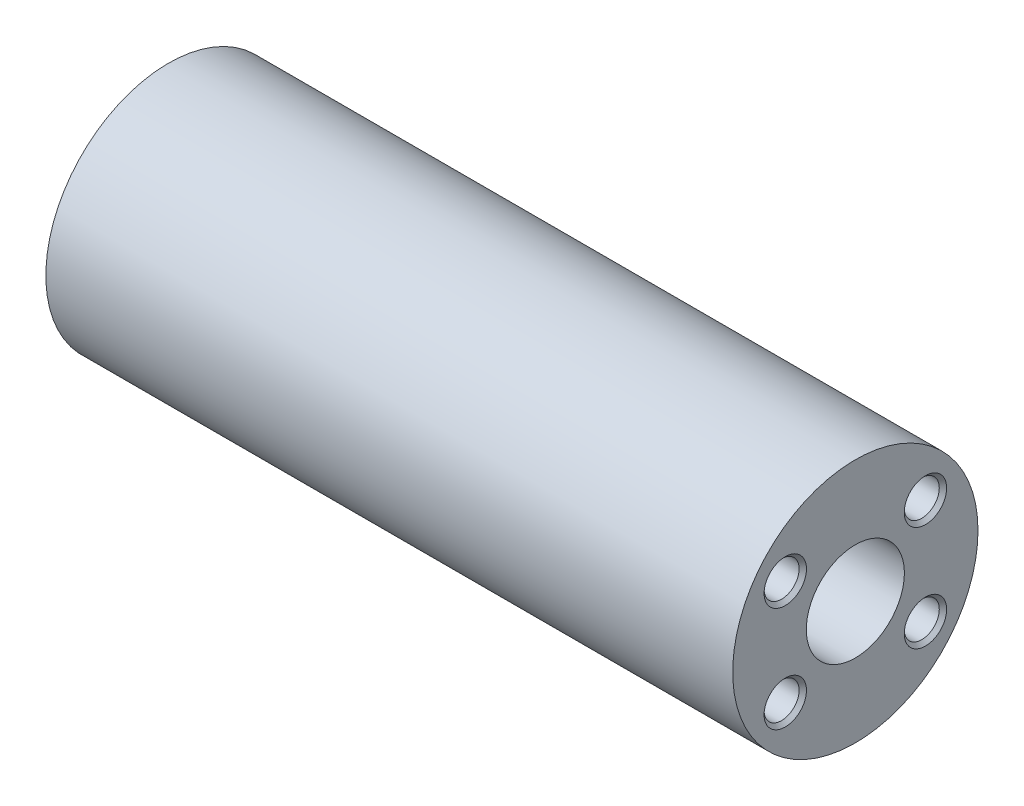
ISO-10303-21;
HEADER;
FILE_DESCRIPTION(('STEP AP214'),'2;1');
FILE_NAME('part.step','',(''),(''),'','','');
FILE_SCHEMA(('AUTOMOTIVE_DESIGN { 1 0 10303 214 1 1 1 1 }'));
ENDSEC;
DATA;
#1=APPLICATION_CONTEXT('core data for automotive mechanical design processes');
#2=APPLICATION_PROTOCOL_DEFINITION('international standard','automotive_design',2000,#1);
#3=PRODUCT_CONTEXT('',#1,'mechanical');
#4=PRODUCT('Part','Part','',(#3));
#5=PRODUCT_RELATED_PRODUCT_CATEGORY('part','',(#4));
#6=PRODUCT_DEFINITION_FORMATION('','',#4);
#7=PRODUCT_DEFINITION_CONTEXT('part definition',#1,'design');
#8=PRODUCT_DEFINITION('design','',#6,#7);
#9=PRODUCT_DEFINITION_SHAPE('','',#8);
#10=(LENGTH_UNIT() NAMED_UNIT(*) SI_UNIT(.MILLI.,.METRE.));
#11=(NAMED_UNIT(*) PLANE_ANGLE_UNIT() SI_UNIT($,.RADIAN.));
#12=(NAMED_UNIT(*) SI_UNIT($,.STERADIAN.) SOLID_ANGLE_UNIT());
#13=UNCERTAINTY_MEASURE_WITH_UNIT(LENGTH_MEASURE(1.E-05),#10,'distance_accuracy_value','');
#14=(GEOMETRIC_REPRESENTATION_CONTEXT(3) GLOBAL_UNCERTAINTY_ASSIGNED_CONTEXT((#13)) GLOBAL_UNIT_ASSIGNED_CONTEXT((#10,
#11,#12)) REPRESENTATION_CONTEXT('',''));
#15=CARTESIAN_POINT('',(0.,0.,0.));
#16=DIRECTION('',(0.,0.,1.));
#17=DIRECTION('',(1.,0.,0.));
#18=AXIS2_PLACEMENT_3D('',#15,#16,#17);
#19=CARTESIAN_POINT('',(49.,0.,0.));
#20=DIRECTION('',(-1.,0.,0.));
#21=DIRECTION('',(0.,0.,1.));
#22=AXIS2_PLACEMENT_3D('',#19,#20,#21);
#23=CYLINDRICAL_SURFACE('',#22,17.5);
#24=CARTESIAN_POINT('',(49.,0.,0.));
#25=DIRECTION('',(1.,0.,0.));
#26=DIRECTION('',(0.,0.,-1.));
#27=AXIS2_PLACEMENT_3D('',#24,#25,#26);
#28=CIRCLE('',#27,17.5);
#29=CARTESIAN_POINT('',(49.,0.,-17.5));
#30=VERTEX_POINT('',#29);
#31=EDGE_CURVE('E11',#30,#30,#28,.T.);
#32=ORIENTED_EDGE('',*,*,#31,.F.);
#33=EDGE_LOOP('',(#32));
#34=FACE_BOUND('',#33,.T.);
#35=CARTESIAN_POINT('',(-49.,0.,0.));
#36=DIRECTION('',(1.,0.,0.));
#37=DIRECTION('',(0.,0.,-1.));
#38=AXIS2_PLACEMENT_3D('',#35,#36,#37);
#39=CIRCLE('',#38,17.5);
#40=CARTESIAN_POINT('',(-49.,0.,-17.5));
#41=VERTEX_POINT('',#40);
#42=EDGE_CURVE('E56',#41,#41,#39,.T.);
#43=ORIENTED_EDGE('',*,*,#42,.T.);
#44=EDGE_LOOP('',(#43));
#45=FACE_BOUND('',#44,.T.);
#46=ADVANCED_FACE('F53',(#34,#45),#23,.T.);
#47=CARTESIAN_POINT('',(49.,0.,0.));
#48=DIRECTION('',(1.,0.,0.));
#49=DIRECTION('',(0.,0.,-1.));
#50=AXIS2_PLACEMENT_3D('',#47,#48,#49);
#51=PLANE('',#50);
#52=CARTESIAN_POINT('',(49.,7.5,-10.));
#53=DIRECTION('',(1.,0.,0.));
#54=DIRECTION('',(0.,0.,-1.));
#55=AXIS2_PLACEMENT_3D('',#52,#53,#54);
#56=CIRCLE('',#55,3.025);
#57=CARTESIAN_POINT('',(49.,7.5,-13.025));
#58=VERTEX_POINT('',#57);
#59=EDGE_CURVE('E129',#58,#58,#56,.T.);
#60=ORIENTED_EDGE('',*,*,#59,.F.);
#61=EDGE_LOOP('',(#60));
#62=FACE_BOUND('',#61,.T.);
#63=CARTESIAN_POINT('',(49.,-7.5,10.));
#64=DIRECTION('',(1.,0.,0.));
#65=DIRECTION('',(0.,0.,-1.));
#66=AXIS2_PLACEMENT_3D('',#63,#64,#65);
#67=CIRCLE('',#66,3.025);
#68=CARTESIAN_POINT('',(49.,-7.5,6.975));
#69=VERTEX_POINT('',#68);
#70=EDGE_CURVE('E138',#69,#69,#67,.T.);
#71=ORIENTED_EDGE('',*,*,#70,.F.);
#72=EDGE_LOOP('',(#71));
#73=FACE_BOUND('',#72,.T.);
#74=CARTESIAN_POINT('',(49.,7.5,10.));
#75=DIRECTION('',(1.,0.,0.));
#76=DIRECTION('',(0.,0.,-1.));
#77=AXIS2_PLACEMENT_3D('',#74,#75,#76);
#78=CIRCLE('',#77,3.025);
#79=CARTESIAN_POINT('',(49.,7.5,6.975));
#80=VERTEX_POINT('',#79);
#81=EDGE_CURVE('E147',#80,#80,#78,.T.);
#82=ORIENTED_EDGE('',*,*,#81,.F.);
#83=EDGE_LOOP('',(#82));
#84=FACE_BOUND('',#83,.T.);
#85=CARTESIAN_POINT('',(49.,-7.5,-10.));
#86=DIRECTION('',(1.,0.,0.));
#87=DIRECTION('',(0.,0.,-1.));
#88=AXIS2_PLACEMENT_3D('',#85,#86,#87);
#89=CIRCLE('',#88,3.025);
#90=CARTESIAN_POINT('',(49.,-7.5,-13.025));
#91=VERTEX_POINT('',#90);
#92=EDGE_CURVE('E156',#91,#91,#89,.T.);
#93=ORIENTED_EDGE('',*,*,#92,.F.);
#94=EDGE_LOOP('',(#93));
#95=FACE_BOUND('',#94,.T.);
#96=CARTESIAN_POINT('',(49.,0.,0.));
#97=DIRECTION('',(1.,0.,0.));
#98=DIRECTION('',(0.,0.,-1.));
#99=AXIS2_PLACEMENT_3D('',#96,#97,#98);
#100=CIRCLE('',#99,7.);
#101=CARTESIAN_POINT('',(49.,0.,-7.));
#102=VERTEX_POINT('',#101);
#103=EDGE_CURVE('E165',#102,#102,#100,.T.);
#104=ORIENTED_EDGE('',*,*,#103,.F.);
#105=EDGE_LOOP('',(#104));
#106=FACE_BOUND('',#105,.T.);
#107=ORIENTED_EDGE('',*,*,#31,.T.);
#108=EDGE_LOOP('',(#107));
#109=FACE_BOUND('',#108,.T.);
#110=ADVANCED_FACE('F179',(#62,#73,#84,#95,#106,#109),#51,.T.);
#111=CARTESIAN_POINT('',(-49.,0.,0.));
#112=DIRECTION('',(1.,0.,0.));
#113=DIRECTION('',(0.,0.,-1.));
#114=AXIS2_PLACEMENT_3D('',#111,#112,#113);
#115=PLANE('',#114);
#116=CARTESIAN_POINT('',(-49.,7.5,-10.));
#117=DIRECTION('',(-1.,0.,0.));
#118=DIRECTION('',(0.,0.,1.));
#119=AXIS2_PLACEMENT_3D('',#116,#117,#118);
#120=CIRCLE('',#119,3.025);
#121=CARTESIAN_POINT('',(-49.,7.5,-6.975));
#122=VERTEX_POINT('',#121);
#123=EDGE_CURVE('E102',#122,#122,#120,.T.);
#124=ORIENTED_EDGE('',*,*,#123,.F.);
#125=EDGE_LOOP('',(#124));
#126=FACE_BOUND('',#125,.T.);
#127=CARTESIAN_POINT('',(-49.,-7.5,10.));
#128=DIRECTION('',(-1.,0.,0.));
#129=DIRECTION('',(0.,0.,1.));
#130=AXIS2_PLACEMENT_3D('',#127,#128,#129);
#131=CIRCLE('',#130,3.025);
#132=CARTESIAN_POINT('',(-49.,-7.5,13.025));
#133=VERTEX_POINT('',#132);
#134=EDGE_CURVE('E95',#133,#133,#131,.T.);
#135=ORIENTED_EDGE('',*,*,#134,.F.);
#136=EDGE_LOOP('',(#135));
#137=FACE_BOUND('',#136,.T.);
#138=CARTESIAN_POINT('',(-49.,7.5,10.));
#139=DIRECTION('',(-1.,0.,0.));
#140=DIRECTION('',(0.,0.,1.));
#141=AXIS2_PLACEMENT_3D('',#138,#139,#140);
#142=CIRCLE('',#141,3.025);
#143=CARTESIAN_POINT('',(-49.,7.5,13.025));
#144=VERTEX_POINT('',#143);
#145=EDGE_CURVE('E111',#144,#144,#142,.T.);
#146=ORIENTED_EDGE('',*,*,#145,.F.);
#147=EDGE_LOOP('',(#146));
#148=FACE_BOUND('',#147,.T.);
#149=CARTESIAN_POINT('',(-49.,-7.5,-10.));
#150=DIRECTION('',(-1.,0.,0.));
#151=DIRECTION('',(0.,0.,1.));
#152=AXIS2_PLACEMENT_3D('',#149,#150,#151);
#153=CIRCLE('',#152,3.025);
#154=CARTESIAN_POINT('',(-49.,-7.5,-6.975));
#155=VERTEX_POINT('',#154);
#156=EDGE_CURVE('E120',#155,#155,#153,.T.);
#157=ORIENTED_EDGE('',*,*,#156,.F.);
#158=EDGE_LOOP('',(#157));
#159=FACE_BOUND('',#158,.T.);
#160=ORIENTED_EDGE('',*,*,#42,.F.);
#161=EDGE_LOOP('',(#160));
#162=FACE_BOUND('',#161,.T.);
#163=ADVANCED_FACE('F176',(#126,#137,#148,#159,#162),#115,.F.);
#164=CARTESIAN_POINT('',(-19.7989898732233,0.,0.));
#165=DIRECTION('',(1.,0.,0.));
#166=DIRECTION('',(0.,0.,-1.));
#167=AXIS2_PLACEMENT_3D('',#164,#165,#166);
#168=CYLINDRICAL_SURFACE('',#167,7.);
#169=CARTESIAN_POINT('',(0.,0.,0.));
#170=DIRECTION('',(1.,0.,0.));
#171=DIRECTION('',(0.,0.,-1.));
#172=AXIS2_PLACEMENT_3D('',#169,#170,#171);
#173=CIRCLE('',#172,7.);
#174=CARTESIAN_POINT('',(0.,0.,-7.));
#175=VERTEX_POINT('',#174);
#176=EDGE_CURVE('E168',#175,#175,#173,.F.);
#177=ORIENTED_EDGE('',*,*,#176,.T.);
#178=EDGE_LOOP('',(#177));
#179=FACE_BOUND('',#178,.T.);
#180=ORIENTED_EDGE('',*,*,#103,.T.);
#181=EDGE_LOOP('',(#180));
#182=FACE_BOUND('',#181,.T.);
#183=ADVANCED_FACE('F178',(#179,#182),#168,.F.);
#184=CARTESIAN_POINT('',(0.,0.,0.));
#185=DIRECTION('',(1.,0.,0.));
#186=DIRECTION('',(0.,0.,-1.));
#187=AXIS2_PLACEMENT_3D('',#184,#185,#186);
#188=PLANE('',#187);
#189=ORIENTED_EDGE('',*,*,#176,.F.);
#190=EDGE_LOOP('',(#189));
#191=FACE_BOUND('',#190,.T.);
#192=ADVANCED_FACE('F186',(#191),#188,.T.);
#193=CARTESIAN_POINT('',(32.5021515475689,-7.5,-10.));
#194=DIRECTION('',(1.,0.,0.));
#195=DIRECTION('',(0.,0.,-1.));
#196=AXIS2_PLACEMENT_3D('',#193,#194,#195);
#197=CONICAL_SURFACE('',#196,2.5,1.02974425867665);
#198=CARTESIAN_POINT('',(31.,-7.5,-10.));
#199=VERTEX_POINT('',#198);
#200=VERTEX_LOOP('',#199);
#201=FACE_BOUND('',#200,.T.);
#202=CARTESIAN_POINT('',(32.5021515475689,-7.5,-10.));
#203=DIRECTION('',(1.,0.,0.));
#204=DIRECTION('',(0.,0.,-1.));
#205=AXIS2_PLACEMENT_3D('',#202,#203,#204);
#206=CIRCLE('',#205,2.5);
#207=CARTESIAN_POINT('',(32.5021515475689,-7.5,-12.5));
#208=VERTEX_POINT('',#207);
#209=EDGE_CURVE('E162',#208,#208,#206,.T.);
#210=ORIENTED_EDGE('',*,*,#209,.T.);
#211=EDGE_LOOP('',(#210));
#212=FACE_BOUND('',#211,.T.);
#213=ADVANCED_FACE('F211',(#201,#212),#197,.F.);
#214=CARTESIAN_POINT('',(49.,-7.5,-10.));
#215=DIRECTION('',(1.,0.,0.));
#216=DIRECTION('',(0.,0.,-1.));
#217=AXIS2_PLACEMENT_3D('',#214,#215,#216);
#218=CYLINDRICAL_SURFACE('',#217,2.5);
#219=ORIENTED_EDGE('',*,*,#209,.F.);
#220=EDGE_LOOP('',(#219));
#221=FACE_BOUND('',#220,.T.);
#222=CARTESIAN_POINT('',(48.475,-7.5,-10.));
#223=DIRECTION('',(1.,0.,0.));
#224=DIRECTION('',(0.,0.,-1.));
#225=AXIS2_PLACEMENT_3D('',#222,#223,#224);
#226=CIRCLE('',#225,2.5);
#227=CARTESIAN_POINT('',(48.475,-7.5,-12.5));
#228=VERTEX_POINT('',#227);
#229=EDGE_CURVE('E159',#228,#228,#226,.T.);
#230=ORIENTED_EDGE('',*,*,#229,.T.);
#231=EDGE_LOOP('',(#230));
#232=FACE_BOUND('',#231,.T.);
#233=ADVANCED_FACE('F225',(#221,#232),#218,.F.);
#234=CARTESIAN_POINT('',(49.,-7.5,-10.));
#235=DIRECTION('',(1.,0.,0.));
#236=DIRECTION('',(0.,0.,-1.));
#237=AXIS2_PLACEMENT_3D('',#234,#235,#236);
#238=CONICAL_SURFACE('',#237,3.025,0.785398163397452);
#239=ORIENTED_EDGE('',*,*,#229,.F.);
#240=EDGE_LOOP('',(#239));
#241=FACE_BOUND('',#240,.T.);
#242=ORIENTED_EDGE('',*,*,#92,.T.);
#243=EDGE_LOOP('',(#242));
#244=FACE_BOUND('',#243,.T.);
#245=ADVANCED_FACE('F235',(#241,#244),#238,.F.);
#246=CARTESIAN_POINT('',(32.5021515475689,7.5,10.));
#247=DIRECTION('',(1.,0.,0.));
#248=DIRECTION('',(0.,0.,-1.));
#249=AXIS2_PLACEMENT_3D('',#246,#247,#248);
#250=CONICAL_SURFACE('',#249,2.5,1.02974425867665);
#251=CARTESIAN_POINT('',(31.,7.5,10.));
#252=VERTEX_POINT('',#251);
#253=VERTEX_LOOP('',#252);
#254=FACE_BOUND('',#253,.T.);
#255=CARTESIAN_POINT('',(32.5021515475689,7.5,10.));
#256=DIRECTION('',(1.,0.,0.));
#257=DIRECTION('',(0.,0.,-1.));
#258=AXIS2_PLACEMENT_3D('',#255,#256,#257);
#259=CIRCLE('',#258,2.5);
#260=CARTESIAN_POINT('',(32.5021515475689,7.5,7.50000000000001));
#261=VERTEX_POINT('',#260);
#262=EDGE_CURVE('E153',#261,#261,#259,.T.);
#263=ORIENTED_EDGE('',*,*,#262,.T.);
#264=EDGE_LOOP('',(#263));
#265=FACE_BOUND('',#264,.T.);
#266=ADVANCED_FACE('F247',(#254,#265),#250,.F.);
#267=CARTESIAN_POINT('',(49.,7.5,10.));
#268=DIRECTION('',(1.,0.,0.));
#269=DIRECTION('',(0.,0.,-1.));
#270=AXIS2_PLACEMENT_3D('',#267,#268,#269);
#271=CYLINDRICAL_SURFACE('',#270,2.5);
#272=ORIENTED_EDGE('',*,*,#262,.F.);
#273=EDGE_LOOP('',(#272));
#274=FACE_BOUND('',#273,.T.);
#275=CARTESIAN_POINT('',(48.475,7.5,10.));
#276=DIRECTION('',(1.,0.,0.));
#277=DIRECTION('',(0.,0.,-1.));
#278=AXIS2_PLACEMENT_3D('',#275,#276,#277);
#279=CIRCLE('',#278,2.5);
#280=CARTESIAN_POINT('',(48.475,7.5,7.5));
#281=VERTEX_POINT('',#280);
#282=EDGE_CURVE('E150',#281,#281,#279,.T.);
#283=ORIENTED_EDGE('',*,*,#282,.T.);
#284=EDGE_LOOP('',(#283));
#285=FACE_BOUND('',#284,.T.);
#286=ADVANCED_FACE('F256',(#274,#285),#271,.F.);
#287=CARTESIAN_POINT('',(49.,7.5,10.));
#288=DIRECTION('',(1.,0.,0.));
#289=DIRECTION('',(0.,0.,-1.));
#290=AXIS2_PLACEMENT_3D('',#287,#288,#289);
#291=CONICAL_SURFACE('',#290,3.025,0.785398163397452);
#292=ORIENTED_EDGE('',*,*,#282,.F.);
#293=EDGE_LOOP('',(#292));
#294=FACE_BOUND('',#293,.T.);
#295=ORIENTED_EDGE('',*,*,#81,.T.);
#296=EDGE_LOOP('',(#295));
#297=FACE_BOUND('',#296,.T.);
#298=ADVANCED_FACE('F265',(#294,#297),#291,.F.);
#299=CARTESIAN_POINT('',(32.5021515475689,-7.5,10.));
#300=DIRECTION('',(1.,0.,0.));
#301=DIRECTION('',(0.,0.,-1.));
#302=AXIS2_PLACEMENT_3D('',#299,#300,#301);
#303=CONICAL_SURFACE('',#302,2.5,1.02974425867665);
#304=CARTESIAN_POINT('',(31.,-7.5,10.));
#305=VERTEX_POINT('',#304);
#306=VERTEX_LOOP('',#305);
#307=FACE_BOUND('',#306,.T.);
#308=CARTESIAN_POINT('',(32.5021515475689,-7.5,10.));
#309=DIRECTION('',(1.,0.,0.));
#310=DIRECTION('',(0.,0.,-1.));
#311=AXIS2_PLACEMENT_3D('',#308,#309,#310);
#312=CIRCLE('',#311,2.5);
#313=CARTESIAN_POINT('',(32.5021515475689,-7.5,7.50000000000001));
#314=VERTEX_POINT('',#313);
#315=EDGE_CURVE('E144',#314,#314,#312,.T.);
#316=ORIENTED_EDGE('',*,*,#315,.T.);
#317=EDGE_LOOP('',(#316));
#318=FACE_BOUND('',#317,.T.);
#319=ADVANCED_FACE('F277',(#307,#318),#303,.F.);
#320=CARTESIAN_POINT('',(49.,-7.5,10.));
#321=DIRECTION('',(1.,0.,0.));
#322=DIRECTION('',(0.,0.,-1.));
#323=AXIS2_PLACEMENT_3D('',#320,#321,#322);
#324=CYLINDRICAL_SURFACE('',#323,2.5);
#325=ORIENTED_EDGE('',*,*,#315,.F.);
#326=EDGE_LOOP('',(#325));
#327=FACE_BOUND('',#326,.T.);
#328=CARTESIAN_POINT('',(48.475,-7.5,10.));
#329=DIRECTION('',(1.,0.,0.));
#330=DIRECTION('',(0.,0.,-1.));
#331=AXIS2_PLACEMENT_3D('',#328,#329,#330);
#332=CIRCLE('',#331,2.5);
#333=CARTESIAN_POINT('',(48.475,-7.5,7.5));
#334=VERTEX_POINT('',#333);
#335=EDGE_CURVE('E141',#334,#334,#332,.T.);
#336=ORIENTED_EDGE('',*,*,#335,.T.);
#337=EDGE_LOOP('',(#336));
#338=FACE_BOUND('',#337,.T.);
#339=ADVANCED_FACE('F286',(#327,#338),#324,.F.);
#340=CARTESIAN_POINT('',(49.,-7.5,10.));
#341=DIRECTION('',(1.,0.,0.));
#342=DIRECTION('',(0.,0.,-1.));
#343=AXIS2_PLACEMENT_3D('',#340,#341,#342);
#344=CONICAL_SURFACE('',#343,3.025,0.785398163397452);
#345=ORIENTED_EDGE('',*,*,#335,.F.);
#346=EDGE_LOOP('',(#345));
#347=FACE_BOUND('',#346,.T.);
#348=ORIENTED_EDGE('',*,*,#70,.T.);
#349=EDGE_LOOP('',(#348));
#350=FACE_BOUND('',#349,.T.);
#351=ADVANCED_FACE('F296',(#347,#350),#344,.F.);
#352=CARTESIAN_POINT('',(32.5021515475689,7.5,-10.));
#353=DIRECTION('',(1.,0.,0.));
#354=DIRECTION('',(0.,0.,-1.));
#355=AXIS2_PLACEMENT_3D('',#352,#353,#354);
#356=CONICAL_SURFACE('',#355,2.5,1.02974425867665);
#357=CARTESIAN_POINT('',(31.,7.5,-10.));
#358=VERTEX_POINT('',#357);
#359=VERTEX_LOOP('',#358);
#360=FACE_BOUND('',#359,.T.);
#361=CARTESIAN_POINT('',(32.5021515475689,7.5,-10.));
#362=DIRECTION('',(1.,0.,0.));
#363=DIRECTION('',(0.,0.,-1.));
#364=AXIS2_PLACEMENT_3D('',#361,#362,#363);
#365=CIRCLE('',#364,2.5);
#366=CARTESIAN_POINT('',(32.5021515475689,7.5,-12.5));
#367=VERTEX_POINT('',#366);
#368=EDGE_CURVE('E135',#367,#367,#365,.T.);
#369=ORIENTED_EDGE('',*,*,#368,.T.);
#370=EDGE_LOOP('',(#369));
#371=FACE_BOUND('',#370,.T.);
#372=ADVANCED_FACE('F308',(#360,#371),#356,.F.);
#373=CARTESIAN_POINT('',(49.,7.5,-10.));
#374=DIRECTION('',(1.,0.,0.));
#375=DIRECTION('',(0.,0.,-1.));
#376=AXIS2_PLACEMENT_3D('',#373,#374,#375);
#377=CYLINDRICAL_SURFACE('',#376,2.5);
#378=ORIENTED_EDGE('',*,*,#368,.F.);
#379=EDGE_LOOP('',(#378));
#380=FACE_BOUND('',#379,.T.);
#381=CARTESIAN_POINT('',(48.475,7.5,-10.));
#382=DIRECTION('',(1.,0.,0.));
#383=DIRECTION('',(0.,0.,-1.));
#384=AXIS2_PLACEMENT_3D('',#381,#382,#383);
#385=CIRCLE('',#384,2.5);
#386=CARTESIAN_POINT('',(48.475,7.5,-12.5));
#387=VERTEX_POINT('',#386);
#388=EDGE_CURVE('E132',#387,#387,#385,.T.);
#389=ORIENTED_EDGE('',*,*,#388,.T.);
#390=EDGE_LOOP('',(#389));
#391=FACE_BOUND('',#390,.T.);
#392=ADVANCED_FACE('F317',(#380,#391),#377,.F.);
#393=CARTESIAN_POINT('',(49.,7.5,-10.));
#394=DIRECTION('',(1.,0.,0.));
#395=DIRECTION('',(0.,0.,-1.));
#396=AXIS2_PLACEMENT_3D('',#393,#394,#395);
#397=CONICAL_SURFACE('',#396,3.025,0.785398163397452);
#398=ORIENTED_EDGE('',*,*,#388,.F.);
#399=EDGE_LOOP('',(#398));
#400=FACE_BOUND('',#399,.T.);
#401=ORIENTED_EDGE('',*,*,#59,.T.);
#402=EDGE_LOOP('',(#401));
#403=FACE_BOUND('',#402,.T.);
#404=ADVANCED_FACE('F326',(#400,#403),#397,.F.);
#405=CARTESIAN_POINT('',(-32.5021515475689,-7.5,-10.));
#406=DIRECTION('',(-1.,0.,0.));
#407=DIRECTION('',(0.,0.,1.));
#408=AXIS2_PLACEMENT_3D('',#405,#406,#407);
#409=CONICAL_SURFACE('',#408,2.5,1.02974425867665);
#410=CARTESIAN_POINT('',(-31.,-7.5,-10.));
#411=VERTEX_POINT('',#410);
#412=VERTEX_LOOP('',#411);
#413=FACE_BOUND('',#412,.T.);
#414=CARTESIAN_POINT('',(-32.5021515475689,-7.5,-10.));
#415=DIRECTION('',(-1.,0.,0.));
#416=DIRECTION('',(0.,0.,1.));
#417=AXIS2_PLACEMENT_3D('',#414,#415,#416);
#418=CIRCLE('',#417,2.5);
#419=CARTESIAN_POINT('',(-32.5021515475689,-7.5,-7.5));
#420=VERTEX_POINT('',#419);
#421=EDGE_CURVE('E126',#420,#420,#418,.T.);
#422=ORIENTED_EDGE('',*,*,#421,.T.);
#423=EDGE_LOOP('',(#422));
#424=FACE_BOUND('',#423,.T.);
#425=ADVANCED_FACE('F337',(#413,#424),#409,.F.);
#426=CARTESIAN_POINT('',(-49.,-7.5,-10.));
#427=DIRECTION('',(-1.,0.,0.));
#428=DIRECTION('',(0.,0.,1.));
#429=AXIS2_PLACEMENT_3D('',#426,#427,#428);
#430=CYLINDRICAL_SURFACE('',#429,2.5);
#431=ORIENTED_EDGE('',*,*,#421,.F.);
#432=EDGE_LOOP('',(#431));
#433=FACE_BOUND('',#432,.T.);
#434=CARTESIAN_POINT('',(-48.475,-7.5,-10.));
#435=DIRECTION('',(-1.,0.,0.));
#436=DIRECTION('',(0.,0.,1.));
#437=AXIS2_PLACEMENT_3D('',#434,#435,#436);
#438=CIRCLE('',#437,2.5);
#439=CARTESIAN_POINT('',(-48.475,-7.5,-7.5));
#440=VERTEX_POINT('',#439);
#441=EDGE_CURVE('E123',#440,#440,#438,.T.);
#442=ORIENTED_EDGE('',*,*,#441,.T.);
#443=EDGE_LOOP('',(#442));
#444=FACE_BOUND('',#443,.T.);
#445=ADVANCED_FACE('F349',(#433,#444),#430,.F.);
#446=CARTESIAN_POINT('',(-49.,-7.5,-10.));
#447=DIRECTION('',(-1.,0.,0.));
#448=DIRECTION('',(0.,0.,1.));
#449=AXIS2_PLACEMENT_3D('',#446,#447,#448);
#450=CONICAL_SURFACE('',#449,3.025,0.785398163397452);
#451=ORIENTED_EDGE('',*,*,#441,.F.);
#452=EDGE_LOOP('',(#451));
#453=FACE_BOUND('',#452,.T.);
#454=ORIENTED_EDGE('',*,*,#156,.T.);
#455=EDGE_LOOP('',(#454));
#456=FACE_BOUND('',#455,.T.);
#457=ADVANCED_FACE('F360',(#453,#456),#450,.F.);
#458=CARTESIAN_POINT('',(-32.5021515475689,7.5,10.));
#459=DIRECTION('',(-1.,0.,0.));
#460=DIRECTION('',(0.,0.,1.));
#461=AXIS2_PLACEMENT_3D('',#458,#459,#460);
#462=CONICAL_SURFACE('',#461,2.5,1.02974425867665);
#463=CARTESIAN_POINT('',(-31.,7.5,10.));
#464=VERTEX_POINT('',#463);
#465=VERTEX_LOOP('',#464);
#466=FACE_BOUND('',#465,.T.);
#467=CARTESIAN_POINT('',(-32.5021515475689,7.5,10.));
#468=DIRECTION('',(-1.,0.,0.));
#469=DIRECTION('',(0.,0.,1.));
#470=AXIS2_PLACEMENT_3D('',#467,#468,#469);
#471=CIRCLE('',#470,2.5);
#472=CARTESIAN_POINT('',(-32.5021515475689,7.5,12.5));
#473=VERTEX_POINT('',#472);
#474=EDGE_CURVE('E117',#473,#473,#471,.T.);
#475=ORIENTED_EDGE('',*,*,#474,.T.);
#476=EDGE_LOOP('',(#475));
#477=FACE_BOUND('',#476,.T.);
#478=ADVANCED_FACE('F370',(#466,#477),#462,.F.);
#479=CARTESIAN_POINT('',(-49.,7.5,10.));
#480=DIRECTION('',(-1.,0.,0.));
#481=DIRECTION('',(0.,0.,1.));
#482=AXIS2_PLACEMENT_3D('',#479,#480,#481);
#483=CYLINDRICAL_SURFACE('',#482,2.5);
#484=ORIENTED_EDGE('',*,*,#474,.F.);
#485=EDGE_LOOP('',(#484));
#486=FACE_BOUND('',#485,.T.);
#487=CARTESIAN_POINT('',(-48.475,7.5,10.));
#488=DIRECTION('',(-1.,0.,0.));
#489=DIRECTION('',(0.,0.,1.));
#490=AXIS2_PLACEMENT_3D('',#487,#488,#489);
#491=CIRCLE('',#490,2.5);
#492=CARTESIAN_POINT('',(-48.475,7.5,12.5));
#493=VERTEX_POINT('',#492);
#494=EDGE_CURVE('E114',#493,#493,#491,.T.);
#495=ORIENTED_EDGE('',*,*,#494,.T.);
#496=EDGE_LOOP('',(#495));
#497=FACE_BOUND('',#496,.T.);
#498=ADVANCED_FACE('F380',(#486,#497),#483,.F.);
#499=CARTESIAN_POINT('',(-49.,7.5,10.));
#500=DIRECTION('',(-1.,0.,0.));
#501=DIRECTION('',(0.,0.,1.));
#502=AXIS2_PLACEMENT_3D('',#499,#500,#501);
#503=CONICAL_SURFACE('',#502,3.025,0.785398163397452);
#504=ORIENTED_EDGE('',*,*,#494,.F.);
#505=EDGE_LOOP('',(#504));
#506=FACE_BOUND('',#505,.T.);
#507=ORIENTED_EDGE('',*,*,#145,.T.);
#508=EDGE_LOOP('',(#507));
#509=FACE_BOUND('',#508,.T.);
#510=ADVANCED_FACE('F391',(#506,#509),#503,.F.);
#511=CARTESIAN_POINT('',(-32.5021515475689,-7.5,10.));
#512=DIRECTION('',(-1.,0.,0.));
#513=DIRECTION('',(0.,0.,1.));
#514=AXIS2_PLACEMENT_3D('',#511,#512,#513);
#515=CONICAL_SURFACE('',#514,2.5,1.02974425867665);
#516=CARTESIAN_POINT('',(-31.,-7.5,10.));
#517=VERTEX_POINT('',#516);
#518=VERTEX_LOOP('',#517);
#519=FACE_BOUND('',#518,.T.);
#520=CARTESIAN_POINT('',(-32.5021515475689,-7.5,10.));
#521=DIRECTION('',(-1.,0.,0.));
#522=DIRECTION('',(0.,0.,1.));
#523=AXIS2_PLACEMENT_3D('',#520,#521,#522);
#524=CIRCLE('',#523,2.5);
#525=CARTESIAN_POINT('',(-32.5021515475689,-7.5,12.5));
#526=VERTEX_POINT('',#525);
#527=EDGE_CURVE('E108',#526,#526,#524,.T.);
#528=ORIENTED_EDGE('',*,*,#527,.T.);
#529=EDGE_LOOP('',(#528));
#530=FACE_BOUND('',#529,.T.);
#531=ADVANCED_FACE('F402',(#519,#530),#515,.F.);
#532=CARTESIAN_POINT('',(-49.,-7.5,10.));
#533=DIRECTION('',(-1.,0.,0.));
#534=DIRECTION('',(0.,0.,1.));
#535=AXIS2_PLACEMENT_3D('',#532,#533,#534);
#536=CYLINDRICAL_SURFACE('',#535,2.5);
#537=ORIENTED_EDGE('',*,*,#527,.F.);
#538=EDGE_LOOP('',(#537));
#539=FACE_BOUND('',#538,.T.);
#540=CARTESIAN_POINT('',(-48.475,-7.5,10.));
#541=DIRECTION('',(-1.,0.,0.));
#542=DIRECTION('',(0.,0.,1.));
#543=AXIS2_PLACEMENT_3D('',#540,#541,#542);
#544=CIRCLE('',#543,2.5);
#545=CARTESIAN_POINT('',(-48.475,-7.5,12.5));
#546=VERTEX_POINT('',#545);
#547=EDGE_CURVE('E99',#546,#546,#544,.T.);
#548=ORIENTED_EDGE('',*,*,#547,.T.);
#549=EDGE_LOOP('',(#548));
#550=FACE_BOUND('',#549,.T.);
#551=ADVANCED_FACE('F412',(#539,#550),#536,.F.);
#552=CARTESIAN_POINT('',(-49.,-7.5,10.));
#553=DIRECTION('',(-1.,0.,0.));
#554=DIRECTION('',(0.,0.,1.));
#555=AXIS2_PLACEMENT_3D('',#552,#553,#554);
#556=CONICAL_SURFACE('',#555,3.025,0.785398163397452);
#557=ORIENTED_EDGE('',*,*,#547,.F.);
#558=EDGE_LOOP('',(#557));
#559=FACE_BOUND('',#558,.T.);
#560=ORIENTED_EDGE('',*,*,#134,.T.);
#561=EDGE_LOOP('',(#560));
#562=FACE_BOUND('',#561,.T.);
#563=ADVANCED_FACE('F89',(#559,#562),#556,.F.);
#564=CARTESIAN_POINT('',(-32.5021515475689,7.5,-10.));
#565=DIRECTION('',(-1.,0.,0.));
#566=DIRECTION('',(0.,0.,1.));
#567=AXIS2_PLACEMENT_3D('',#564,#565,#566);
#568=CONICAL_SURFACE('',#567,2.5,1.02974425867665);
#569=CARTESIAN_POINT('',(-31.,7.5,-10.));
#570=VERTEX_POINT('',#569);
#571=VERTEX_LOOP('',#570);
#572=FACE_BOUND('',#571,.T.);
#573=CARTESIAN_POINT('',(-32.5021515475689,7.5,-10.));
#574=DIRECTION('',(-1.,0.,0.));
#575=DIRECTION('',(0.,0.,1.));
#576=AXIS2_PLACEMENT_3D('',#573,#574,#575);
#577=CIRCLE('',#576,2.5);
#578=CARTESIAN_POINT('',(-32.5021515475689,7.5,-7.5));
#579=VERTEX_POINT('',#578);
#580=EDGE_CURVE('E93',#579,#579,#577,.T.);
#581=ORIENTED_EDGE('',*,*,#580,.T.);
#582=EDGE_LOOP('',(#581));
#583=FACE_BOUND('',#582,.T.);
#584=ADVANCED_FACE('F85',(#572,#583),#568,.F.);
#585=CARTESIAN_POINT('',(-49.,7.5,-10.));
#586=DIRECTION('',(-1.,0.,0.));
#587=DIRECTION('',(0.,0.,1.));
#588=AXIS2_PLACEMENT_3D('',#585,#586,#587);
#589=CYLINDRICAL_SURFACE('',#588,2.5);
#590=ORIENTED_EDGE('',*,*,#580,.F.);
#591=EDGE_LOOP('',(#590));
#592=FACE_BOUND('',#591,.T.);
#593=CARTESIAN_POINT('',(-48.475,7.5,-10.));
#594=DIRECTION('',(-1.,0.,0.));
#595=DIRECTION('',(0.,0.,1.));
#596=AXIS2_PLACEMENT_3D('',#593,#594,#595);
#597=CIRCLE('',#596,2.5);
#598=CARTESIAN_POINT('',(-48.475,7.5,-7.5));
#599=VERTEX_POINT('',#598);
#600=EDGE_CURVE('E96',#599,#599,#597,.T.);
#601=ORIENTED_EDGE('',*,*,#600,.T.);
#602=EDGE_LOOP('',(#601));
#603=FACE_BOUND('',#602,.T.);
#604=ADVANCED_FACE('F88',(#592,#603),#589,.F.);
#605=CARTESIAN_POINT('',(-49.,7.5,-10.));
#606=DIRECTION('',(-1.,0.,0.));
#607=DIRECTION('',(0.,0.,1.));
#608=AXIS2_PLACEMENT_3D('',#605,#606,#607);
#609=CONICAL_SURFACE('',#608,3.025,0.785398163397452);
#610=ORIENTED_EDGE('',*,*,#600,.F.);
#611=EDGE_LOOP('',(#610));
#612=FACE_BOUND('',#611,.T.);
#613=ORIENTED_EDGE('',*,*,#123,.T.);
#614=EDGE_LOOP('',(#613));
#615=FACE_BOUND('',#614,.T.);
#616=ADVANCED_FACE('F449',(#612,#615),#609,.F.);
#617=CLOSED_SHELL('',(#46,#110,#163,#183,#192,#213,#233,#245,#266,#286,#298,#319,#339,#351,#372,
#392,#404,#425,#445,#457,#478,#498,#510,#531,#551,#563,#584,#604,#616));
#618=MANIFOLD_SOLID_BREP('B2',#617);
#619=ADVANCED_BREP_SHAPE_REPRESENTATION('',(#18,#618),#14);
#620=SHAPE_DEFINITION_REPRESENTATION(#9,#619);
ENDSEC;
END-ISO-10303-21;
